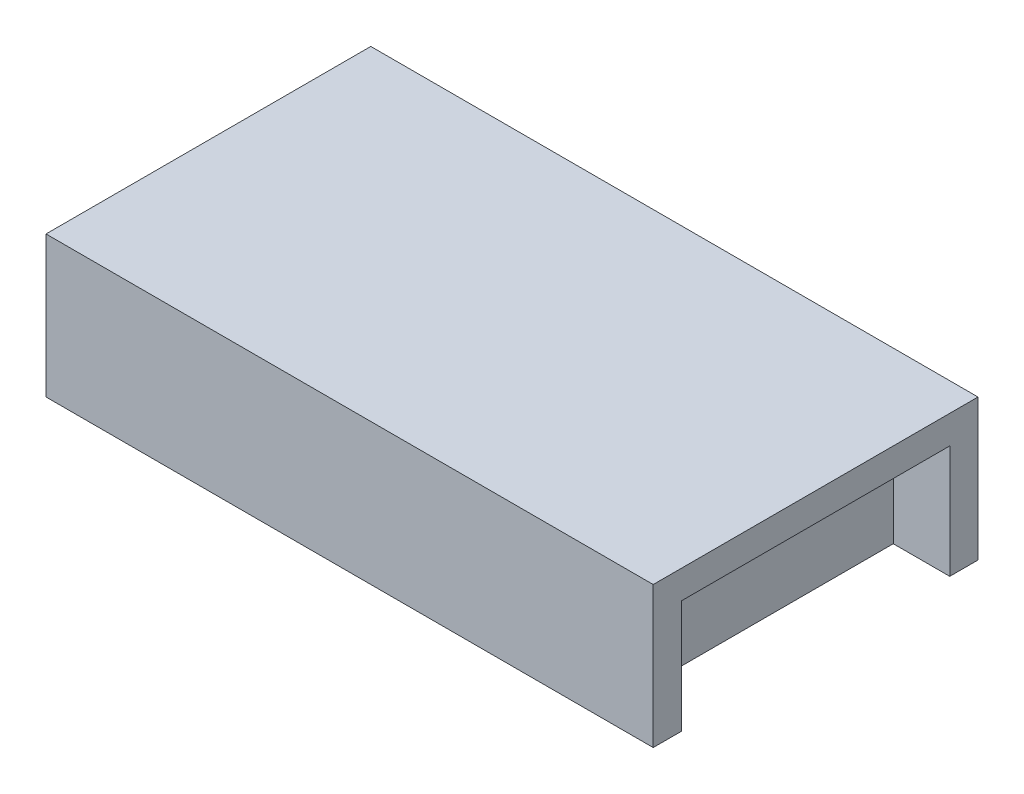
ISO-10303-21;
HEADER;
FILE_DESCRIPTION(('STEP AP214'),'2;1');
FILE_NAME('part.step','',(''),(''),'','','');
FILE_SCHEMA(('AUTOMOTIVE_DESIGN { 1 0 10303 214 1 1 1 1 }'));
ENDSEC;
DATA;
#1=APPLICATION_CONTEXT('core data for automotive mechanical design processes');
#2=APPLICATION_PROTOCOL_DEFINITION('international standard','automotive_design',2000,#1);
#3=PRODUCT_CONTEXT('',#1,'mechanical');
#4=PRODUCT('Part','Part','',(#3));
#5=PRODUCT_RELATED_PRODUCT_CATEGORY('part','',(#4));
#6=PRODUCT_DEFINITION_FORMATION('','',#4);
#7=PRODUCT_DEFINITION_CONTEXT('part definition',#1,'design');
#8=PRODUCT_DEFINITION('design','',#6,#7);
#9=PRODUCT_DEFINITION_SHAPE('','',#8);
#10=(LENGTH_UNIT() NAMED_UNIT(*) SI_UNIT(.MILLI.,.METRE.));
#11=(NAMED_UNIT(*) PLANE_ANGLE_UNIT() SI_UNIT($,.RADIAN.));
#12=(NAMED_UNIT(*) SI_UNIT($,.STERADIAN.) SOLID_ANGLE_UNIT());
#13=UNCERTAINTY_MEASURE_WITH_UNIT(LENGTH_MEASURE(1.E-05),#10,'distance_accuracy_value','');
#14=(GEOMETRIC_REPRESENTATION_CONTEXT(3) GLOBAL_UNCERTAINTY_ASSIGNED_CONTEXT((#13)) GLOBAL_UNIT_ASSIGNED_CONTEXT((#10,
#11,#12)) REPRESENTATION_CONTEXT('',''));
#15=CARTESIAN_POINT('',(0.,0.,0.));
#16=DIRECTION('',(0.,0.,1.));
#17=DIRECTION('',(1.,0.,0.));
#18=AXIS2_PLACEMENT_3D('',#15,#16,#17);
#19=CARTESIAN_POINT('',(107.5,50.,57.5));
#20=DIRECTION('',(-1.,0.,0.));
#21=DIRECTION('',(0.,0.,1.));
#22=AXIS2_PLACEMENT_3D('',#19,#20,#21);
#23=PLANE('',#22);
#24=DIRECTION('',(0.,0.,1.));
#25=VECTOR('',#24,1.);
#26=CARTESIAN_POINT('',(107.5,40.,47.5));
#27=LINE('',#26,#25);
#28=CARTESIAN_POINT('',(107.5,40.,-47.5));
#29=VERTEX_POINT('',#28);
#30=CARTESIAN_POINT('',(107.5,40.,47.5));
#31=VERTEX_POINT('',#30);
#32=EDGE_CURVE('E114',#29,#31,#27,.T.);
#33=ORIENTED_EDGE('',*,*,#32,.F.);
#34=DIRECTION('',(0.,-1.,0.));
#35=VECTOR('',#34,1.);
#36=CARTESIAN_POINT('',(107.5,40.,-47.5));
#37=LINE('',#36,#35);
#38=CARTESIAN_POINT('',(107.5,0.,-47.5));
#39=VERTEX_POINT('',#38);
#40=EDGE_CURVE('E170',#29,#39,#37,.T.);
#41=ORIENTED_EDGE('',*,*,#40,.T.);
#42=DIRECTION('',(0.,0.,-1.));
#43=VECTOR('',#42,1.);
#44=CARTESIAN_POINT('',(107.5,0.,57.5));
#45=LINE('',#44,#43);
#46=CARTESIAN_POINT('',(107.5,0.,-57.5));
#47=VERTEX_POINT('',#46);
#48=EDGE_CURVE('E143',#39,#47,#45,.T.);
#49=ORIENTED_EDGE('',*,*,#48,.T.);
#50=DIRECTION('',(0.,-1.,0.));
#51=VECTOR('',#50,1.);
#52=CARTESIAN_POINT('',(107.5,50.,-57.5));
#53=LINE('',#52,#51);
#54=CARTESIAN_POINT('',(107.5,50.,-57.5));
#55=VERTEX_POINT('',#54);
#56=EDGE_CURVE('E11',#55,#47,#53,.T.);
#57=ORIENTED_EDGE('',*,*,#56,.F.);
#58=DIRECTION('',(0.,0.,-1.));
#59=VECTOR('',#58,1.);
#60=CARTESIAN_POINT('',(107.5,50.,57.5));
#61=LINE('',#60,#59);
#62=CARTESIAN_POINT('',(107.5,50.,57.5));
#63=VERTEX_POINT('',#62);
#64=EDGE_CURVE('E134',#63,#55,#61,.T.);
#65=ORIENTED_EDGE('',*,*,#64,.F.);
#66=DIRECTION('',(0.,-1.,0.));
#67=VECTOR('',#66,1.);
#68=CARTESIAN_POINT('',(107.5,50.,57.5));
#69=LINE('',#68,#67);
#70=CARTESIAN_POINT('',(107.5,0.,57.5));
#71=VERTEX_POINT('',#70);
#72=EDGE_CURVE('E140',#63,#71,#69,.T.);
#73=ORIENTED_EDGE('',*,*,#72,.T.);
#74=CARTESIAN_POINT('',(107.5,0.,47.5));
#75=VERTEX_POINT('',#74);
#76=EDGE_CURVE('E127',#71,#75,#45,.T.);
#77=ORIENTED_EDGE('',*,*,#76,.T.);
#78=DIRECTION('',(0.,-1.,0.));
#79=VECTOR('',#78,1.);
#80=CARTESIAN_POINT('',(107.5,40.,47.5));
#81=LINE('',#80,#79);
#82=EDGE_CURVE('E48',#31,#75,#81,.T.);
#83=ORIENTED_EDGE('',*,*,#82,.F.);
#84=EDGE_LOOP('',(#33,#41,#49,#57,#65,#73,#77,#83));
#85=FACE_BOUND('',#84,.T.);
#86=ADVANCED_FACE('F34',(#85),#23,.F.);
#87=CARTESIAN_POINT('',(-107.5,50.,-57.5));
#88=DIRECTION('',(0.,0.,1.));
#89=DIRECTION('',(1.,0.,0.));
#90=AXIS2_PLACEMENT_3D('',#87,#88,#89);
#91=PLANE('',#90);
#92=DIRECTION('',(-1.,0.,0.));
#93=VECTOR('',#92,1.);
#94=CARTESIAN_POINT('',(-107.5,0.,-57.5));
#95=LINE('',#94,#93);
#96=CARTESIAN_POINT('',(-107.5,0.,-57.5));
#97=VERTEX_POINT('',#96);
#98=EDGE_CURVE('E142',#47,#97,#95,.T.);
#99=ORIENTED_EDGE('',*,*,#98,.T.);
#100=DIRECTION('',(0.,-1.,0.));
#101=VECTOR('',#100,1.);
#102=CARTESIAN_POINT('',(-107.5,50.,-57.5));
#103=LINE('',#102,#101);
#104=CARTESIAN_POINT('',(-107.5,50.,-57.5));
#105=VERTEX_POINT('',#104);
#106=EDGE_CURVE('E41',#105,#97,#103,.T.);
#107=ORIENTED_EDGE('',*,*,#106,.F.);
#108=DIRECTION('',(-1.,0.,0.));
#109=VECTOR('',#108,1.);
#110=CARTESIAN_POINT('',(-107.5,50.,-57.5));
#111=LINE('',#110,#109);
#112=EDGE_CURVE('E85',#55,#105,#111,.T.);
#113=ORIENTED_EDGE('',*,*,#112,.F.);
#114=ORIENTED_EDGE('',*,*,#56,.T.);
#115=EDGE_LOOP('',(#99,#107,#113,#114));
#116=FACE_BOUND('',#115,.T.);
#117=ADVANCED_FACE('F177',(#116),#91,.F.);
#118=CARTESIAN_POINT('',(-107.5,50.,57.5));
#119=DIRECTION('',(1.,0.,0.));
#120=DIRECTION('',(0.,0.,-1.));
#121=AXIS2_PLACEMENT_3D('',#118,#119,#120);
#122=PLANE('',#121);
#123=DIRECTION('',(0.,0.,1.));
#124=VECTOR('',#123,1.);
#125=CARTESIAN_POINT('',(-107.5,0.,57.5));
#126=LINE('',#125,#124);
#127=CARTESIAN_POINT('',(-107.5,0.,57.5));
#128=VERTEX_POINT('',#127);
#129=EDGE_CURVE('E145',#97,#128,#126,.T.);
#130=ORIENTED_EDGE('',*,*,#129,.T.);
#131=DIRECTION('',(0.,-1.,0.));
#132=VECTOR('',#131,1.);
#133=CARTESIAN_POINT('',(-107.5,50.,57.5));
#134=LINE('',#133,#132);
#135=CARTESIAN_POINT('',(-107.5,50.,57.5));
#136=VERTEX_POINT('',#135);
#137=EDGE_CURVE('E149',#136,#128,#134,.T.);
#138=ORIENTED_EDGE('',*,*,#137,.F.);
#139=DIRECTION('',(0.,0.,1.));
#140=VECTOR('',#139,1.);
#141=CARTESIAN_POINT('',(-107.5,50.,57.5));
#142=LINE('',#141,#140);
#143=EDGE_CURVE('E137',#105,#136,#142,.T.);
#144=ORIENTED_EDGE('',*,*,#143,.F.);
#145=ORIENTED_EDGE('',*,*,#106,.T.);
#146=EDGE_LOOP('',(#130,#138,#144,#145));
#147=FACE_BOUND('',#146,.T.);
#148=ADVANCED_FACE('F154',(#147),#122,.F.);
#149=CARTESIAN_POINT('',(-107.5,50.,57.5));
#150=DIRECTION('',(0.,0.,-1.));
#151=DIRECTION('',(-1.,0.,0.));
#152=AXIS2_PLACEMENT_3D('',#149,#150,#151);
#153=PLANE('',#152);
#154=DIRECTION('',(1.,0.,0.));
#155=VECTOR('',#154,1.);
#156=CARTESIAN_POINT('',(-107.5,0.,57.5));
#157=LINE('',#156,#155);
#158=EDGE_CURVE('E78',#128,#71,#157,.T.);
#159=ORIENTED_EDGE('',*,*,#158,.T.);
#160=ORIENTED_EDGE('',*,*,#72,.F.);
#161=DIRECTION('',(1.,0.,0.));
#162=VECTOR('',#161,1.);
#163=CARTESIAN_POINT('',(-107.5,50.,57.5));
#164=LINE('',#163,#162);
#165=EDGE_CURVE('E57',#136,#63,#164,.T.);
#166=ORIENTED_EDGE('',*,*,#165,.F.);
#167=ORIENTED_EDGE('',*,*,#137,.T.);
#168=EDGE_LOOP('',(#159,#160,#166,#167));
#169=FACE_BOUND('',#168,.T.);
#170=ADVANCED_FACE('F183',(#169),#153,.F.);
#171=CARTESIAN_POINT('',(0.,50.,0.));
#172=DIRECTION('',(0.,-1.,0.));
#173=DIRECTION('',(0.,0.,-1.));
#174=AXIS2_PLACEMENT_3D('',#171,#172,#173);
#175=PLANE('',#174);
#176=ORIENTED_EDGE('',*,*,#64,.T.);
#177=ORIENTED_EDGE('',*,*,#112,.T.);
#178=ORIENTED_EDGE('',*,*,#143,.T.);
#179=ORIENTED_EDGE('',*,*,#165,.T.);
#180=EDGE_LOOP('',(#176,#177,#178,#179));
#181=FACE_BOUND('',#180,.T.);
#182=ADVANCED_FACE('F188',(#181),#175,.F.);
#183=CARTESIAN_POINT('',(0.,0.,0.));
#184=DIRECTION('',(0.,-1.,0.));
#185=DIRECTION('',(0.,0.,-1.));
#186=AXIS2_PLACEMENT_3D('',#183,#184,#185);
#187=PLANE('',#186);
#188=DIRECTION('',(1.,0.,0.));
#189=VECTOR('',#188,1.);
#190=CARTESIAN_POINT('',(107.5,0.,-47.5));
#191=LINE('',#190,#189);
#192=CARTESIAN_POINT('',(87.5,0.,-47.5));
#193=VERTEX_POINT('',#192);
#194=EDGE_CURVE('E123',#193,#39,#191,.T.);
#195=ORIENTED_EDGE('',*,*,#194,.F.);
#196=DIRECTION('',(0.,0.,-1.));
#197=VECTOR('',#196,1.);
#198=CARTESIAN_POINT('',(87.5,0.,47.5));
#199=LINE('',#198,#197);
#200=CARTESIAN_POINT('',(87.5,0.,47.5));
#201=VERTEX_POINT('',#200);
#202=EDGE_CURVE('E164',#201,#193,#199,.T.);
#203=ORIENTED_EDGE('',*,*,#202,.F.);
#204=DIRECTION('',(-1.,0.,0.));
#205=VECTOR('',#204,1.);
#206=CARTESIAN_POINT('',(107.5,0.,47.5));
#207=LINE('',#206,#205);
#208=EDGE_CURVE('E162',#75,#201,#207,.T.);
#209=ORIENTED_EDGE('',*,*,#208,.F.);
#210=ORIENTED_EDGE('',*,*,#76,.F.);
#211=ORIENTED_EDGE('',*,*,#158,.F.);
#212=ORIENTED_EDGE('',*,*,#129,.F.);
#213=ORIENTED_EDGE('',*,*,#98,.F.);
#214=ORIENTED_EDGE('',*,*,#48,.F.);
#215=EDGE_LOOP('',(#195,#203,#209,#210,#211,#212,#213,#214));
#216=FACE_BOUND('',#215,.T.);
#217=ADVANCED_FACE('F159',(#216),#187,.T.);
#218=CARTESIAN_POINT('',(107.5,40.,-47.5));
#219=DIRECTION('',(0.,0.,-1.));
#220=DIRECTION('',(-1.,0.,0.));
#221=AXIS2_PLACEMENT_3D('',#218,#219,#220);
#222=PLANE('',#221);
#223=ORIENTED_EDGE('',*,*,#194,.T.);
#224=ORIENTED_EDGE('',*,*,#40,.F.);
#225=DIRECTION('',(1.,0.,0.));
#226=VECTOR('',#225,1.);
#227=CARTESIAN_POINT('',(107.5,40.,-47.5));
#228=LINE('',#227,#226);
#229=CARTESIAN_POINT('',(87.5,40.,-47.5));
#230=VERTEX_POINT('',#229);
#231=EDGE_CURVE('E120',#230,#29,#228,.T.);
#232=ORIENTED_EDGE('',*,*,#231,.F.);
#233=DIRECTION('',(0.,-1.,0.));
#234=VECTOR('',#233,1.);
#235=CARTESIAN_POINT('',(87.5,40.,-47.5));
#236=LINE('',#235,#234);
#237=EDGE_CURVE('E129',#230,#193,#236,.T.);
#238=ORIENTED_EDGE('',*,*,#237,.T.);
#239=EDGE_LOOP('',(#223,#224,#232,#238));
#240=FACE_BOUND('',#239,.T.);
#241=ADVANCED_FACE('F172',(#240),#222,.F.);
#242=CARTESIAN_POINT('',(87.5,40.,47.5));
#243=DIRECTION('',(-1.,0.,0.));
#244=DIRECTION('',(0.,0.,1.));
#245=AXIS2_PLACEMENT_3D('',#242,#243,#244);
#246=PLANE('',#245);
#247=ORIENTED_EDGE('',*,*,#202,.T.);
#248=ORIENTED_EDGE('',*,*,#237,.F.);
#249=DIRECTION('',(0.,0.,-1.));
#250=VECTOR('',#249,1.);
#251=CARTESIAN_POINT('',(87.5,40.,47.5));
#252=LINE('',#251,#250);
#253=CARTESIAN_POINT('',(87.5,40.,47.5));
#254=VERTEX_POINT('',#253);
#255=EDGE_CURVE('E113',#254,#230,#252,.T.);
#256=ORIENTED_EDGE('',*,*,#255,.F.);
#257=DIRECTION('',(0.,-1.,0.));
#258=VECTOR('',#257,1.);
#259=CARTESIAN_POINT('',(87.5,40.,47.5));
#260=LINE('',#259,#258);
#261=EDGE_CURVE('E109',#254,#201,#260,.T.);
#262=ORIENTED_EDGE('',*,*,#261,.T.);
#263=EDGE_LOOP('',(#247,#248,#256,#262));
#264=FACE_BOUND('',#263,.T.);
#265=ADVANCED_FACE('F174',(#264),#246,.F.);
#266=CARTESIAN_POINT('',(107.5,40.,47.5));
#267=DIRECTION('',(0.,0.,1.));
#268=DIRECTION('',(1.,0.,0.));
#269=AXIS2_PLACEMENT_3D('',#266,#267,#268);
#270=PLANE('',#269);
#271=ORIENTED_EDGE('',*,*,#208,.T.);
#272=ORIENTED_EDGE('',*,*,#261,.F.);
#273=DIRECTION('',(-1.,0.,0.));
#274=VECTOR('',#273,1.);
#275=CARTESIAN_POINT('',(107.5,40.,47.5));
#276=LINE('',#275,#274);
#277=EDGE_CURVE('E106',#31,#254,#276,.T.);
#278=ORIENTED_EDGE('',*,*,#277,.F.);
#279=ORIENTED_EDGE('',*,*,#82,.T.);
#280=EDGE_LOOP('',(#271,#272,#278,#279));
#281=FACE_BOUND('',#280,.T.);
#282=ADVANCED_FACE('F108',(#281),#270,.F.);
#283=CARTESIAN_POINT('',(0.,40.,0.));
#284=DIRECTION('',(0.,1.,0.));
#285=DIRECTION('',(0.,0.,1.));
#286=AXIS2_PLACEMENT_3D('',#283,#284,#285);
#287=PLANE('',#286);
#288=ORIENTED_EDGE('',*,*,#32,.T.);
#289=ORIENTED_EDGE('',*,*,#277,.T.);
#290=ORIENTED_EDGE('',*,*,#255,.T.);
#291=ORIENTED_EDGE('',*,*,#231,.T.);
#292=EDGE_LOOP('',(#288,#289,#290,#291));
#293=FACE_BOUND('',#292,.T.);
#294=ADVANCED_FACE('F118',(#293),#287,.F.);
#295=CLOSED_SHELL('',(#86,#117,#148,#170,#182,#217,#241,#265,#282,#294));
#296=MANIFOLD_SOLID_BREP('B2',#295);
#297=ADVANCED_BREP_SHAPE_REPRESENTATION('',(#18,#296),#14);
#298=SHAPE_DEFINITION_REPRESENTATION(#9,#297);
ENDSEC;
END-ISO-10303-21;
